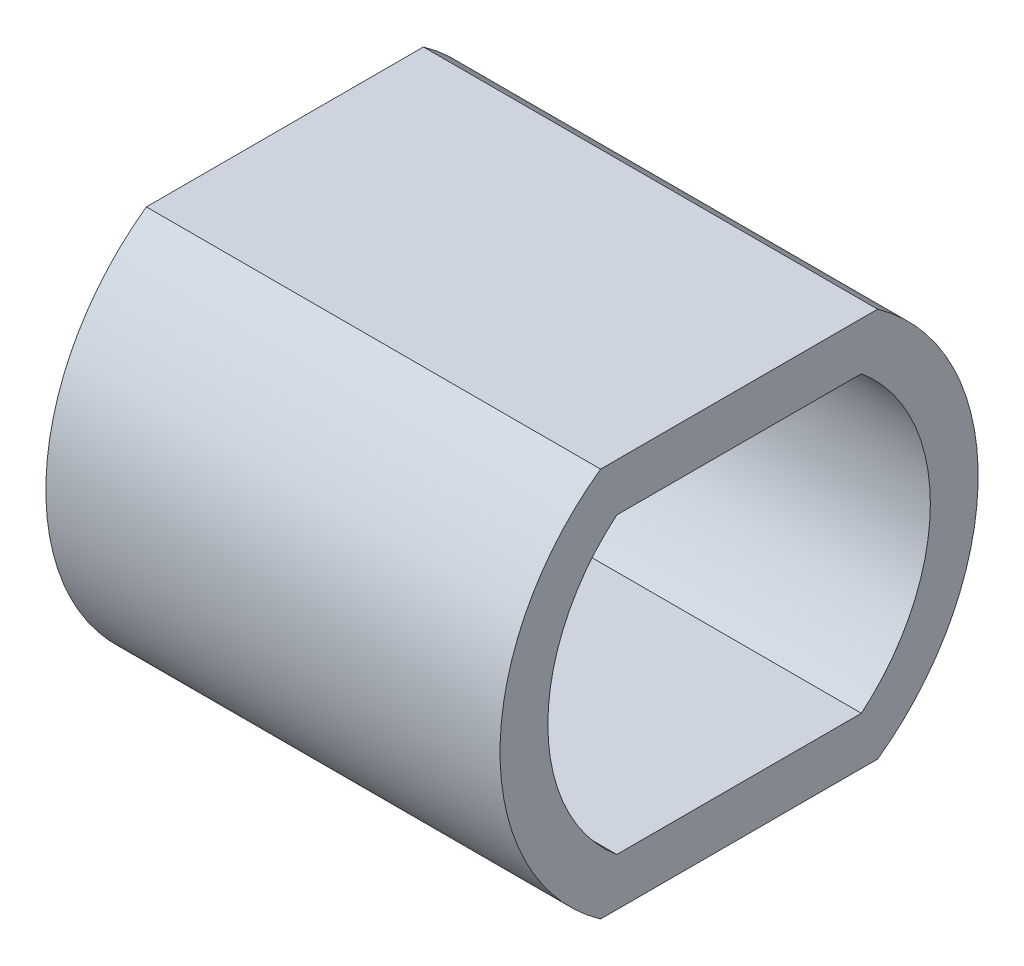
ISO-10303-21;
HEADER;
FILE_DESCRIPTION(('STEP AP214'),'2;1');
FILE_NAME('part.step','',(''),(''),'','','');
FILE_SCHEMA(('AUTOMOTIVE_DESIGN { 1 0 10303 214 1 1 1 1 }'));
ENDSEC;
DATA;
#1=APPLICATION_CONTEXT('core data for automotive mechanical design processes');
#2=APPLICATION_PROTOCOL_DEFINITION('international standard','automotive_design',2000,#1);
#3=PRODUCT_CONTEXT('',#1,'mechanical');
#4=PRODUCT('Part','Part','',(#3));
#5=PRODUCT_RELATED_PRODUCT_CATEGORY('part','',(#4));
#6=PRODUCT_DEFINITION_FORMATION('','',#4);
#7=PRODUCT_DEFINITION_CONTEXT('part definition',#1,'design');
#8=PRODUCT_DEFINITION('design','',#6,#7);
#9=PRODUCT_DEFINITION_SHAPE('','',#8);
#10=(LENGTH_UNIT() NAMED_UNIT(*) SI_UNIT(.MILLI.,.METRE.));
#11=(NAMED_UNIT(*) PLANE_ANGLE_UNIT() SI_UNIT($,.RADIAN.));
#12=(NAMED_UNIT(*) SI_UNIT($,.STERADIAN.) SOLID_ANGLE_UNIT());
#13=UNCERTAINTY_MEASURE_WITH_UNIT(LENGTH_MEASURE(1.E-05),#10,'distance_accuracy_value','');
#14=(GEOMETRIC_REPRESENTATION_CONTEXT(3) GLOBAL_UNCERTAINTY_ASSIGNED_CONTEXT((#13)) GLOBAL_UNIT_ASSIGNED_CONTEXT((#10,
#11,#12)) REPRESENTATION_CONTEXT('',''));
#15=CARTESIAN_POINT('',(0.,0.,0.));
#16=DIRECTION('',(0.,0.,1.));
#17=DIRECTION('',(1.,0.,0.));
#18=AXIS2_PLACEMENT_3D('',#15,#16,#17);
#19=CARTESIAN_POINT('',(-2.,-1.3,0.));
#20=DIRECTION('',(0.,1.,0.));
#21=DIRECTION('',(0.,0.,1.));
#22=AXIS2_PLACEMENT_3D('',#19,#20,#21);
#23=PLANE('',#22);
#24=DIRECTION('',(0.,0.,1.));
#25=VECTOR('',#24,1.);
#26=CARTESIAN_POINT('',(0.,-1.3,0.));
#27=LINE('',#26,#25);
#28=CARTESIAN_POINT('',(0.,-1.3,5.7));
#29=VERTEX_POINT('',#28);
#30=CARTESIAN_POINT('',(0.,-1.3,6.5));
#31=VERTEX_POINT('',#30);
#32=EDGE_CURVE('E280',#29,#31,#27,.T.);
#33=ORIENTED_EDGE('',*,*,#32,.F.);
#34=DIRECTION('',(1.,0.,0.));
#35=VECTOR('',#34,1.);
#36=CARTESIAN_POINT('',(-2.,-1.3,5.7));
#37=LINE('',#36,#35);
#38=CARTESIAN_POINT('',(-2.,-1.3,5.7));
#39=VERTEX_POINT('',#38);
#40=EDGE_CURVE('E12',#39,#29,#37,.T.);
#41=ORIENTED_EDGE('',*,*,#40,.F.);
#42=DIRECTION('',(0.,0.,1.));
#43=VECTOR('',#42,1.);
#44=CARTESIAN_POINT('',(-2.,-1.3,0.));
#45=LINE('',#44,#43);
#46=CARTESIAN_POINT('',(-2.,-1.3,6.5));
#47=VERTEX_POINT('',#46);
#48=EDGE_CURVE('E255',#39,#47,#45,.T.);
#49=ORIENTED_EDGE('',*,*,#48,.T.);
#50=DIRECTION('',(1.,0.,0.));
#51=VECTOR('',#50,1.);
#52=CARTESIAN_POINT('',(-2.,-1.3,6.5));
#53=LINE('',#52,#51);
#54=EDGE_CURVE('E304',#47,#31,#53,.T.);
#55=ORIENTED_EDGE('',*,*,#54,.T.);
#56=EDGE_LOOP('',(#33,#41,#49,#55));
#57=FACE_BOUND('',#56,.T.);
#58=ADVANCED_FACE('F85',(#57),#23,.T.);
#59=CARTESIAN_POINT('',(-2.,0.,5.7));
#60=DIRECTION('',(0.,0.,-1.));
#61=DIRECTION('',(-1.,0.,0.));
#62=AXIS2_PLACEMENT_3D('',#59,#60,#61);
#63=PLANE('',#62);
#64=DIRECTION('',(0.,1.,0.));
#65=VECTOR('',#64,1.);
#66=CARTESIAN_POINT('',(0.,0.,5.7));
#67=LINE('',#66,#65);
#68=CARTESIAN_POINT('',(0.,1.3,5.7));
#69=VERTEX_POINT('',#68);
#70=EDGE_CURVE('E289',#29,#69,#67,.T.);
#71=ORIENTED_EDGE('',*,*,#70,.T.);
#72=DIRECTION('',(1.,0.,0.));
#73=VECTOR('',#72,1.);
#74=CARTESIAN_POINT('',(-2.,1.3,5.7));
#75=LINE('',#74,#73);
#76=CARTESIAN_POINT('',(-2.,1.3,5.7));
#77=VERTEX_POINT('',#76);
#78=EDGE_CURVE('E95',#77,#69,#75,.T.);
#79=ORIENTED_EDGE('',*,*,#78,.F.);
#80=DIRECTION('',(0.,1.,0.));
#81=VECTOR('',#80,1.);
#82=CARTESIAN_POINT('',(-2.,0.,5.7));
#83=LINE('',#82,#81);
#84=EDGE_CURVE('E196',#39,#77,#83,.T.);
#85=ORIENTED_EDGE('',*,*,#84,.F.);
#86=ORIENTED_EDGE('',*,*,#40,.T.);
#87=EDGE_LOOP('',(#71,#79,#85,#86));
#88=FACE_BOUND('',#87,.T.);
#89=ADVANCED_FACE('F425',(#88),#63,.F.);
#90=CARTESIAN_POINT('',(-2.,1.3,0.));
#91=DIRECTION('',(0.,1.,0.));
#92=DIRECTION('',(0.,0.,1.));
#93=AXIS2_PLACEMENT_3D('',#90,#91,#92);
#94=PLANE('',#93);
#95=DIRECTION('',(0.,0.,1.));
#96=VECTOR('',#95,1.);
#97=CARTESIAN_POINT('',(0.,1.3,0.));
#98=LINE('',#97,#96);
#99=CARTESIAN_POINT('',(0.,1.3,6.5));
#100=VERTEX_POINT('',#99);
#101=EDGE_CURVE('E286',#69,#100,#98,.T.);
#102=ORIENTED_EDGE('',*,*,#101,.T.);
#103=DIRECTION('',(1.,0.,0.));
#104=VECTOR('',#103,1.);
#105=CARTESIAN_POINT('',(-2.,1.3,6.5));
#106=LINE('',#105,#104);
#107=CARTESIAN_POINT('',(-2.,1.3,6.5));
#108=VERTEX_POINT('',#107);
#109=EDGE_CURVE('E302',#108,#100,#106,.T.);
#110=ORIENTED_EDGE('',*,*,#109,.F.);
#111=DIRECTION('',(0.,0.,1.));
#112=VECTOR('',#111,1.);
#113=CARTESIAN_POINT('',(-2.,1.3,0.));
#114=LINE('',#113,#112);
#115=EDGE_CURVE('E261',#77,#108,#114,.T.);
#116=ORIENTED_EDGE('',*,*,#115,.F.);
#117=ORIENTED_EDGE('',*,*,#78,.T.);
#118=EDGE_LOOP('',(#102,#110,#116,#117));
#119=FACE_BOUND('',#118,.T.);
#120=ADVANCED_FACE('F431',(#119),#94,.F.);
#121=CARTESIAN_POINT('',(-2.,-1.3,0.));
#122=DIRECTION('',(0.,1.,0.));
#123=DIRECTION('',(0.,0.,1.));
#124=AXIS2_PLACEMENT_3D('',#121,#122,#123);
#125=PLANE('',#124);
#126=DIRECTION('',(0.,0.,1.));
#127=VECTOR('',#126,1.);
#128=CARTESIAN_POINT('',(0.,-1.3,0.));
#129=LINE('',#128,#127);
#130=CARTESIAN_POINT('',(0.,-1.3,-6.5));
#131=VERTEX_POINT('',#130);
#132=CARTESIAN_POINT('',(0.,-1.3,-5.7));
#133=VERTEX_POINT('',#132);
#134=EDGE_CURVE('E268',#131,#133,#129,.T.);
#135=ORIENTED_EDGE('',*,*,#134,.F.);
#136=DIRECTION('',(1.,0.,0.));
#137=VECTOR('',#136,1.);
#138=CARTESIAN_POINT('',(-2.,-1.3,-6.5));
#139=LINE('',#138,#137);
#140=CARTESIAN_POINT('',(-2.,-1.3,-6.5));
#141=VERTEX_POINT('',#140);
#142=EDGE_CURVE('E306',#141,#131,#139,.T.);
#143=ORIENTED_EDGE('',*,*,#142,.F.);
#144=DIRECTION('',(0.,0.,1.));
#145=VECTOR('',#144,1.);
#146=CARTESIAN_POINT('',(-2.,-1.3,0.));
#147=LINE('',#146,#145);
#148=CARTESIAN_POINT('',(-2.,-1.3,-5.7));
#149=VERTEX_POINT('',#148);
#150=EDGE_CURVE('E244',#141,#149,#147,.T.);
#151=ORIENTED_EDGE('',*,*,#150,.T.);
#152=DIRECTION('',(1.,0.,0.));
#153=VECTOR('',#152,1.);
#154=CARTESIAN_POINT('',(-2.,-1.3,-5.7));
#155=LINE('',#154,#153);
#156=EDGE_CURVE('E89',#149,#133,#155,.T.);
#157=ORIENTED_EDGE('',*,*,#156,.T.);
#158=EDGE_LOOP('',(#135,#143,#151,#157));
#159=FACE_BOUND('',#158,.T.);
#160=ADVANCED_FACE('F442',(#159),#125,.T.);
#161=CARTESIAN_POINT('',(-2.,0.,-6.5));
#162=DIRECTION('',(0.,0.,-1.));
#163=DIRECTION('',(-1.,0.,0.));
#164=AXIS2_PLACEMENT_3D('',#161,#162,#163);
#165=PLANE('',#164);
#166=DIRECTION('',(0.,1.,0.));
#167=VECTOR('',#166,1.);
#168=CARTESIAN_POINT('',(0.,0.,-6.5));
#169=LINE('',#168,#167);
#170=CARTESIAN_POINT('',(0.,1.3,-6.5));
#171=VERTEX_POINT('',#170);
#172=EDGE_CURVE('E277',#131,#171,#169,.T.);
#173=ORIENTED_EDGE('',*,*,#172,.T.);
#174=DIRECTION('',(1.,0.,0.));
#175=VECTOR('',#174,1.);
#176=CARTESIAN_POINT('',(-2.,1.3,-6.5));
#177=LINE('',#176,#175);
#178=CARTESIAN_POINT('',(-2.,1.3,-6.5));
#179=VERTEX_POINT('',#178);
#180=EDGE_CURVE('E308',#179,#171,#177,.T.);
#181=ORIENTED_EDGE('',*,*,#180,.F.);
#182=DIRECTION('',(0.,1.,0.));
#183=VECTOR('',#182,1.);
#184=CARTESIAN_POINT('',(-2.,0.,-6.5));
#185=LINE('',#184,#183);
#186=EDGE_CURVE('E252',#141,#179,#185,.T.);
#187=ORIENTED_EDGE('',*,*,#186,.F.);
#188=ORIENTED_EDGE('',*,*,#142,.T.);
#189=EDGE_LOOP('',(#173,#181,#187,#188));
#190=FACE_BOUND('',#189,.T.);
#191=ADVANCED_FACE('F438',(#190),#165,.F.);
#192=CARTESIAN_POINT('',(-2.,1.3,0.));
#193=DIRECTION('',(0.,1.,0.));
#194=DIRECTION('',(0.,0.,1.));
#195=AXIS2_PLACEMENT_3D('',#192,#193,#194);
#196=PLANE('',#195);
#197=DIRECTION('',(0.,0.,1.));
#198=VECTOR('',#197,1.);
#199=CARTESIAN_POINT('',(0.,1.3,0.));
#200=LINE('',#199,#198);
#201=CARTESIAN_POINT('',(0.,1.3,-5.7));
#202=VERTEX_POINT('',#201);
#203=EDGE_CURVE('E274',#171,#202,#200,.T.);
#204=ORIENTED_EDGE('',*,*,#203,.T.);
#205=DIRECTION('',(1.,0.,0.));
#206=VECTOR('',#205,1.);
#207=CARTESIAN_POINT('',(-2.,1.3,-5.7));
#208=LINE('',#207,#206);
#209=CARTESIAN_POINT('',(-2.,1.3,-5.7));
#210=VERTEX_POINT('',#209);
#211=EDGE_CURVE('E310',#210,#202,#208,.T.);
#212=ORIENTED_EDGE('',*,*,#211,.F.);
#213=DIRECTION('',(0.,0.,1.));
#214=VECTOR('',#213,1.);
#215=CARTESIAN_POINT('',(-2.,1.3,0.));
#216=LINE('',#215,#214);
#217=EDGE_CURVE('E250',#179,#210,#216,.T.);
#218=ORIENTED_EDGE('',*,*,#217,.F.);
#219=ORIENTED_EDGE('',*,*,#180,.T.);
#220=EDGE_LOOP('',(#204,#212,#218,#219));
#221=FACE_BOUND('',#220,.T.);
#222=ADVANCED_FACE('F441',(#221),#196,.F.);
#223=CARTESIAN_POINT('',(-2.,0.,6.5));
#224=DIRECTION('',(0.,0.,-1.));
#225=DIRECTION('',(-1.,0.,0.));
#226=AXIS2_PLACEMENT_3D('',#223,#224,#225);
#227=PLANE('',#226);
#228=DIRECTION('',(0.,1.,0.));
#229=VECTOR('',#228,1.);
#230=CARTESIAN_POINT('',(0.,0.,6.5));
#231=LINE('',#230,#229);
#232=EDGE_CURVE('E283',#31,#100,#231,.T.);
#233=ORIENTED_EDGE('',*,*,#232,.F.);
#234=ORIENTED_EDGE('',*,*,#54,.F.);
#235=DIRECTION('',(0.,1.,0.));
#236=VECTOR('',#235,1.);
#237=CARTESIAN_POINT('',(-2.,0.,6.5));
#238=LINE('',#237,#236);
#239=EDGE_CURVE('E258',#47,#108,#238,.T.);
#240=ORIENTED_EDGE('',*,*,#239,.T.);
#241=ORIENTED_EDGE('',*,*,#109,.T.);
#242=EDGE_LOOP('',(#233,#234,#240,#241));
#243=FACE_BOUND('',#242,.T.);
#244=ADVANCED_FACE('F436',(#243),#227,.T.);
#245=CARTESIAN_POINT('',(-2.,0.,-5.7));
#246=DIRECTION('',(0.,0.,-1.));
#247=DIRECTION('',(-1.,0.,0.));
#248=AXIS2_PLACEMENT_3D('',#245,#246,#247);
#249=PLANE('',#248);
#250=DIRECTION('',(0.,1.,0.));
#251=VECTOR('',#250,1.);
#252=CARTESIAN_POINT('',(0.,0.,-5.7));
#253=LINE('',#252,#251);
#254=EDGE_CURVE('E271',#133,#202,#253,.T.);
#255=ORIENTED_EDGE('',*,*,#254,.F.);
#256=ORIENTED_EDGE('',*,*,#156,.F.);
#257=DIRECTION('',(0.,1.,0.));
#258=VECTOR('',#257,1.);
#259=CARTESIAN_POINT('',(-2.,0.,-5.7));
#260=LINE('',#259,#258);
#261=EDGE_CURVE('E248',#149,#210,#260,.T.);
#262=ORIENTED_EDGE('',*,*,#261,.T.);
#263=ORIENTED_EDGE('',*,*,#211,.T.);
#264=EDGE_LOOP('',(#255,#256,#262,#263));
#265=FACE_BOUND('',#264,.T.);
#266=ADVANCED_FACE('F447',(#265),#249,.T.);
#267=CARTESIAN_POINT('',(-2.,0.,0.));
#268=DIRECTION('',(1.,0.,0.));
#269=DIRECTION('',(0.,0.,-1.));
#270=AXIS2_PLACEMENT_3D('',#267,#268,#269);
#271=CYLINDRICAL_SURFACE('',#270,4.5);
#272=CARTESIAN_POINT('',(-2.,0.,0.));
#273=DIRECTION('',(1.,0.,0.));
#274=DIRECTION('',(0.,0.,-1.));
#275=AXIS2_PLACEMENT_3D('',#272,#273,#274);
#276=CIRCLE('',#275,4.5);
#277=CARTESIAN_POINT('',(-2.,0.,-4.5));
#278=VERTEX_POINT('',#277);
#279=EDGE_CURVE('E241',#278,#278,#276,.T.);
#280=ORIENTED_EDGE('',*,*,#279,.F.);
#281=EDGE_LOOP('',(#280));
#282=FACE_BOUND('',#281,.T.);
#283=CARTESIAN_POINT('',(0.,0.,0.));
#284=DIRECTION('',(1.,0.,0.));
#285=DIRECTION('',(0.,0.,-1.));
#286=AXIS2_PLACEMENT_3D('',#283,#284,#285);
#287=CIRCLE('',#286,4.5);
#288=CARTESIAN_POINT('',(0.,0.,-4.5));
#289=VERTEX_POINT('',#288);
#290=EDGE_CURVE('E240',#289,#289,#287,.T.);
#291=ORIENTED_EDGE('',*,*,#290,.T.);
#292=EDGE_LOOP('',(#291));
#293=FACE_BOUND('',#292,.T.);
#294=ADVANCED_FACE('F87',(#282,#293),#271,.F.);
#295=CARTESIAN_POINT('',(-2.,0.,0.));
#296=DIRECTION('',(1.,0.,0.));
#297=DIRECTION('',(0.,0.,-1.));
#298=AXIS2_PLACEMENT_3D('',#295,#296,#297);
#299=PLANE('',#298);
#300=ORIENTED_EDGE('',*,*,#279,.T.);
#301=EDGE_LOOP('',(#300));
#302=FACE_BOUND('',#301,.T.);
#303=ORIENTED_EDGE('',*,*,#150,.F.);
#304=ORIENTED_EDGE('',*,*,#186,.T.);
#305=ORIENTED_EDGE('',*,*,#217,.T.);
#306=ORIENTED_EDGE('',*,*,#261,.F.);
#307=EDGE_LOOP('',(#303,#304,#305,#306));
#308=FACE_BOUND('',#307,.T.);
#309=ORIENTED_EDGE('',*,*,#48,.F.);
#310=ORIENTED_EDGE('',*,*,#84,.T.);
#311=ORIENTED_EDGE('',*,*,#115,.T.);
#312=ORIENTED_EDGE('',*,*,#239,.F.);
#313=EDGE_LOOP('',(#309,#310,#311,#312));
#314=FACE_BOUND('',#313,.T.);
#315=DIRECTION('',(0.,0.,-1.));
#316=VECTOR('',#315,1.);
#317=CARTESIAN_POINT('',(-2.,6.15,0.));
#318=LINE('',#317,#316);
#319=CARTESIAN_POINT('',(-2.,6.15,5.11639521538358));
#320=VERTEX_POINT('',#319);
#321=CARTESIAN_POINT('',(-2.,6.15,-5.11639521538358));
#322=VERTEX_POINT('',#321);
#323=EDGE_CURVE('E104',#320,#322,#318,.T.);
#324=ORIENTED_EDGE('',*,*,#323,.T.);
#325=CARTESIAN_POINT('',(-2.,0.,0.));
#326=DIRECTION('',(1.,0.,0.));
#327=DIRECTION('',(0.,0.,-1.));
#328=AXIS2_PLACEMENT_3D('',#325,#326,#327);
#329=CIRCLE('',#328,8.);
#330=CARTESIAN_POINT('',(-2.,-6.15,-5.11639521538358));
#331=VERTEX_POINT('',#330);
#332=EDGE_CURVE('E185',#331,#322,#329,.T.);
#333=ORIENTED_EDGE('',*,*,#332,.F.);
#334=DIRECTION('',(0.,0.,-1.));
#335=VECTOR('',#334,1.);
#336=CARTESIAN_POINT('',(-2.,-6.15,0.));
#337=LINE('',#336,#335);
#338=CARTESIAN_POINT('',(-2.,-6.15,5.11639521538358));
#339=VERTEX_POINT('',#338);
#340=EDGE_CURVE('E179',#339,#331,#337,.T.);
#341=ORIENTED_EDGE('',*,*,#340,.F.);
#342=EDGE_CURVE('E175',#320,#339,#329,.T.);
#343=ORIENTED_EDGE('',*,*,#342,.F.);
#344=EDGE_LOOP('',(#324,#333,#341,#343));
#345=FACE_BOUND('',#344,.T.);
#346=ADVANCED_FACE('F176',(#302,#308,#314,#345),#299,.F.);
#347=CARTESIAN_POINT('',(0.,0.,0.));
#348=DIRECTION('',(1.,0.,0.));
#349=DIRECTION('',(0.,0.,-1.));
#350=AXIS2_PLACEMENT_3D('',#347,#348,#349);
#351=PLANE('',#350);
#352=ORIENTED_EDGE('',*,*,#290,.F.);
#353=EDGE_LOOP('',(#352));
#354=FACE_BOUND('',#353,.T.);
#355=ORIENTED_EDGE('',*,*,#134,.T.);
#356=ORIENTED_EDGE('',*,*,#254,.T.);
#357=ORIENTED_EDGE('',*,*,#203,.F.);
#358=ORIENTED_EDGE('',*,*,#172,.F.);
#359=EDGE_LOOP('',(#355,#356,#357,#358));
#360=FACE_BOUND('',#359,.T.);
#361=ORIENTED_EDGE('',*,*,#32,.T.);
#362=ORIENTED_EDGE('',*,*,#232,.T.);
#363=ORIENTED_EDGE('',*,*,#101,.F.);
#364=ORIENTED_EDGE('',*,*,#70,.F.);
#365=EDGE_LOOP('',(#361,#362,#363,#364));
#366=FACE_BOUND('',#365,.T.);
#367=DIRECTION('',(0.,0.,-1.));
#368=VECTOR('',#367,1.);
#369=CARTESIAN_POINT('',(0.,6.15,0.));
#370=LINE('',#369,#368);
#371=CARTESIAN_POINT('',(0.,6.15,5.11639521538358));
#372=VERTEX_POINT('',#371);
#373=CARTESIAN_POINT('',(0.,6.15,-5.11639521538358));
#374=VERTEX_POINT('',#373);
#375=EDGE_CURVE('E291',#372,#374,#370,.T.);
#376=ORIENTED_EDGE('',*,*,#375,.F.);
#377=CARTESIAN_POINT('',(0.,0.,0.));
#378=DIRECTION('',(1.,0.,0.));
#379=DIRECTION('',(0.,0.,-1.));
#380=AXIS2_PLACEMENT_3D('',#377,#378,#379);
#381=CIRCLE('',#380,8.);
#382=CARTESIAN_POINT('',(0.,-6.15,5.11639521538358));
#383=VERTEX_POINT('',#382);
#384=EDGE_CURVE('E294',#372,#383,#381,.T.);
#385=ORIENTED_EDGE('',*,*,#384,.T.);
#386=DIRECTION('',(0.,0.,-1.));
#387=VECTOR('',#386,1.);
#388=CARTESIAN_POINT('',(0.,-6.15,0.));
#389=LINE('',#388,#387);
#390=CARTESIAN_POINT('',(0.,-6.15,-5.11639521538358));
#391=VERTEX_POINT('',#390);
#392=EDGE_CURVE('E297',#383,#391,#389,.T.);
#393=ORIENTED_EDGE('',*,*,#392,.T.);
#394=EDGE_CURVE('E245',#391,#374,#381,.T.);
#395=ORIENTED_EDGE('',*,*,#394,.T.);
#396=EDGE_LOOP('',(#376,#385,#393,#395));
#397=FACE_BOUND('',#396,.T.);
#398=ADVANCED_FACE('F411',(#354,#360,#366,#397),#351,.T.);
#399=CARTESIAN_POINT('',(-4.,6.15,0.));
#400=DIRECTION('',(0.,-1.,0.));
#401=DIRECTION('',(0.,0.,-1.));
#402=AXIS2_PLACEMENT_3D('',#399,#400,#401);
#403=PLANE('',#402);
#404=ORIENTED_EDGE('',*,*,#323,.F.);
#405=DIRECTION('',(1.,0.,0.));
#406=VECTOR('',#405,1.);
#407=CARTESIAN_POINT('',(-4.,6.15,5.11639521538358));
#408=LINE('',#407,#406);
#409=CARTESIAN_POINT('',(-4.,6.15,5.11639521538358));
#410=VERTEX_POINT('',#409);
#411=EDGE_CURVE('E192',#410,#320,#408,.T.);
#412=ORIENTED_EDGE('',*,*,#411,.F.);
#413=DIRECTION('',(0.,0.,-1.));
#414=VECTOR('',#413,1.);
#415=CARTESIAN_POINT('',(-4.,6.15,0.));
#416=LINE('',#415,#414);
#417=CARTESIAN_POINT('',(-4.,6.15,-5.11639521538358));
#418=VERTEX_POINT('',#417);
#419=EDGE_CURVE('E334',#410,#418,#416,.T.);
#420=ORIENTED_EDGE('',*,*,#419,.T.);
#421=DIRECTION('',(1.,0.,0.));
#422=VECTOR('',#421,1.);
#423=CARTESIAN_POINT('',(-4.,6.15,-5.11639521538358));
#424=LINE('',#423,#422);
#425=EDGE_CURVE('E195',#418,#322,#424,.T.);
#426=ORIENTED_EDGE('',*,*,#425,.T.);
#427=EDGE_LOOP('',(#404,#412,#420,#426));
#428=FACE_BOUND('',#427,.T.);
#429=ADVANCED_FACE('F189',(#428),#403,.T.);
#430=CARTESIAN_POINT('',(-4.,0.,0.));
#431=DIRECTION('',(1.,0.,0.));
#432=DIRECTION('',(0.,0.,-1.));
#433=AXIS2_PLACEMENT_3D('',#430,#431,#432);
#434=CYLINDRICAL_SURFACE('',#433,8.);
#435=DIRECTION('',(1.,0.,0.));
#436=VECTOR('',#435,1.);
#437=CARTESIAN_POINT('',(-4.,-6.15,-5.11639521538358));
#438=LINE('',#437,#436);
#439=CARTESIAN_POINT('',(-4.,-6.15,-5.11639521538358));
#440=VERTEX_POINT('',#439);
#441=EDGE_CURVE('E211',#440,#331,#438,.T.);
#442=ORIENTED_EDGE('',*,*,#441,.T.);
#443=ORIENTED_EDGE('',*,*,#332,.T.);
#444=ORIENTED_EDGE('',*,*,#425,.F.);
#445=CARTESIAN_POINT('',(-4.,0.,0.));
#446=DIRECTION('',(1.,0.,0.));
#447=DIRECTION('',(0.,0.,-1.));
#448=AXIS2_PLACEMENT_3D('',#445,#446,#447);
#449=CIRCLE('',#448,8.);
#450=EDGE_CURVE('E335',#440,#418,#449,.T.);
#451=ORIENTED_EDGE('',*,*,#450,.F.);
#452=EDGE_LOOP('',(#442,#443,#444,#451));
#453=FACE_BOUND('',#452,.T.);
#454=ADVANCED_FACE('F315',(#453),#434,.F.);
#455=CARTESIAN_POINT('',(-4.,-6.15,0.));
#456=DIRECTION('',(0.,-1.,0.));
#457=DIRECTION('',(0.,0.,-1.));
#458=AXIS2_PLACEMENT_3D('',#455,#456,#457);
#459=PLANE('',#458);
#460=DIRECTION('',(1.,0.,0.));
#461=VECTOR('',#460,1.);
#462=CARTESIAN_POINT('',(-4.,-6.15,5.11639521538358));
#463=LINE('',#462,#461);
#464=CARTESIAN_POINT('',(-4.,-6.15,5.11639521538358));
#465=VERTEX_POINT('',#464);
#466=EDGE_CURVE('E204',#465,#339,#463,.T.);
#467=ORIENTED_EDGE('',*,*,#466,.T.);
#468=ORIENTED_EDGE('',*,*,#340,.T.);
#469=ORIENTED_EDGE('',*,*,#441,.F.);
#470=DIRECTION('',(0.,0.,-1.));
#471=VECTOR('',#470,1.);
#472=CARTESIAN_POINT('',(-4.,-6.15,0.));
#473=LINE('',#472,#471);
#474=EDGE_CURVE('E326',#465,#440,#473,.T.);
#475=ORIENTED_EDGE('',*,*,#474,.F.);
#476=EDGE_LOOP('',(#467,#468,#469,#475));
#477=FACE_BOUND('',#476,.T.);
#478=ADVANCED_FACE('F321',(#477),#459,.F.);
#479=CARTESIAN_POINT('',(-4.,0.,0.));
#480=DIRECTION('',(1.,0.,0.));
#481=DIRECTION('',(0.,0.,-1.));
#482=AXIS2_PLACEMENT_3D('',#479,#480,#481);
#483=CYLINDRICAL_SURFACE('',#482,8.);
#484=ORIENTED_EDGE('',*,*,#411,.T.);
#485=ORIENTED_EDGE('',*,*,#342,.T.);
#486=ORIENTED_EDGE('',*,*,#466,.F.);
#487=CARTESIAN_POINT('',(-4.,0.,0.));
#488=DIRECTION('',(1.,0.,0.));
#489=DIRECTION('',(0.,0.,-1.));
#490=AXIS2_PLACEMENT_3D('',#487,#488,#489);
#491=CIRCLE('',#490,8.);
#492=EDGE_CURVE('E200',#410,#465,#491,.T.);
#493=ORIENTED_EDGE('',*,*,#492,.F.);
#494=EDGE_LOOP('',(#484,#485,#486,#493));
#495=FACE_BOUND('',#494,.T.);
#496=ADVANCED_FACE('F198',(#495),#483,.F.);
#497=CARTESIAN_POINT('',(-4.,0.,0.));
#498=DIRECTION('',(1.,0.,0.));
#499=DIRECTION('',(0.,0.,-1.));
#500=AXIS2_PLACEMENT_3D('',#497,#498,#499);
#501=PLANE('',#500);
#502=DIRECTION('',(0.,0.,-1.));
#503=VECTOR('',#502,1.);
#504=CARTESIAN_POINT('',(-4.,8.15,0.));
#505=LINE('',#504,#503);
#506=CARTESIAN_POINT('',(-4.,8.15,5.79460956406901));
#507=VERTEX_POINT('',#506);
#508=CARTESIAN_POINT('',(-4.,8.15,-5.79460956406901));
#509=VERTEX_POINT('',#508);
#510=EDGE_CURVE('E216',#507,#509,#505,.T.);
#511=ORIENTED_EDGE('',*,*,#510,.T.);
#512=CARTESIAN_POINT('',(-4.,0.,0.));
#513=DIRECTION('',(1.,0.,0.));
#514=DIRECTION('',(0.,0.,-1.));
#515=AXIS2_PLACEMENT_3D('',#512,#513,#514);
#516=CIRCLE('',#515,10.);
#517=CARTESIAN_POINT('',(-4.,-8.15,-5.79460956406901));
#518=VERTEX_POINT('',#517);
#519=EDGE_CURVE('E219',#518,#509,#516,.T.);
#520=ORIENTED_EDGE('',*,*,#519,.F.);
#521=DIRECTION('',(0.,0.,-1.));
#522=VECTOR('',#521,1.);
#523=CARTESIAN_POINT('',(-4.,-8.15,0.));
#524=LINE('',#523,#522);
#525=CARTESIAN_POINT('',(-4.,-8.15,5.79460956406901));
#526=VERTEX_POINT('',#525);
#527=EDGE_CURVE('E222',#526,#518,#524,.T.);
#528=ORIENTED_EDGE('',*,*,#527,.F.);
#529=CARTESIAN_POINT('',(-4.,0.,0.));
#530=DIRECTION('',(1.,0.,0.));
#531=DIRECTION('',(0.,0.,-1.));
#532=AXIS2_PLACEMENT_3D('',#529,#530,#531);
#533=CIRCLE('',#532,10.);
#534=EDGE_CURVE('E225',#507,#526,#533,.T.);
#535=ORIENTED_EDGE('',*,*,#534,.F.);
#536=EDGE_LOOP('',(#511,#520,#528,#535));
#537=FACE_BOUND('',#536,.T.);
#538=ORIENTED_EDGE('',*,*,#419,.F.);
#539=ORIENTED_EDGE('',*,*,#492,.T.);
#540=ORIENTED_EDGE('',*,*,#474,.T.);
#541=ORIENTED_EDGE('',*,*,#450,.T.);
#542=EDGE_LOOP('',(#538,#539,#540,#541));
#543=FACE_BOUND('',#542,.T.);
#544=ADVANCED_FACE('F333',(#537,#543),#501,.F.);
#545=CARTESIAN_POINT('',(-4.,8.15,0.));
#546=DIRECTION('',(0.,-1.,0.));
#547=DIRECTION('',(0.,0.,-1.));
#548=AXIS2_PLACEMENT_3D('',#545,#546,#547);
#549=PLANE('',#548);
#550=DIRECTION('',(1.,0.,0.));
#551=VECTOR('',#550,1.);
#552=CARTESIAN_POINT('',(-4.,8.15,5.79460956406901));
#553=LINE('',#552,#551);
#554=CARTESIAN_POINT('',(15.,8.15,5.79460956406901));
#555=VERTEX_POINT('',#554);
#556=EDGE_CURVE('E228',#507,#555,#553,.T.);
#557=ORIENTED_EDGE('',*,*,#556,.T.);
#558=DIRECTION('',(0.,0.,-1.));
#559=VECTOR('',#558,1.);
#560=CARTESIAN_POINT('',(15.,8.15,0.));
#561=LINE('',#560,#559);
#562=CARTESIAN_POINT('',(15.,8.15,-5.79460956406901));
#563=VERTEX_POINT('',#562);
#564=EDGE_CURVE('E348',#555,#563,#561,.T.);
#565=ORIENTED_EDGE('',*,*,#564,.T.);
#566=DIRECTION('',(1.,0.,0.));
#567=VECTOR('',#566,1.);
#568=CARTESIAN_POINT('',(-4.,8.15,-5.79460956406901));
#569=LINE('',#568,#567);
#570=EDGE_CURVE('E237',#509,#563,#569,.T.);
#571=ORIENTED_EDGE('',*,*,#570,.F.);
#572=ORIENTED_EDGE('',*,*,#510,.F.);
#573=EDGE_LOOP('',(#557,#565,#571,#572));
#574=FACE_BOUND('',#573,.T.);
#575=ADVANCED_FACE('F480',(#574),#549,.F.);
#576=CARTESIAN_POINT('',(-4.,0.,0.));
#577=DIRECTION('',(1.,0.,0.));
#578=DIRECTION('',(0.,0.,-1.));
#579=AXIS2_PLACEMENT_3D('',#576,#577,#578);
#580=CYLINDRICAL_SURFACE('',#579,10.);
#581=ORIENTED_EDGE('',*,*,#570,.T.);
#582=CARTESIAN_POINT('',(15.,0.,0.));
#583=DIRECTION('',(1.,0.,0.));
#584=DIRECTION('',(0.,0.,-1.));
#585=AXIS2_PLACEMENT_3D('',#582,#583,#584);
#586=CIRCLE('',#585,10.);
#587=CARTESIAN_POINT('',(15.,-8.15,-5.79460956406901));
#588=VERTEX_POINT('',#587);
#589=EDGE_CURVE('E345',#588,#563,#586,.T.);
#590=ORIENTED_EDGE('',*,*,#589,.F.);
#591=DIRECTION('',(1.,0.,0.));
#592=VECTOR('',#591,1.);
#593=CARTESIAN_POINT('',(-4.,-8.15,-5.79460956406901));
#594=LINE('',#593,#592);
#595=EDGE_CURVE('E234',#518,#588,#594,.T.);
#596=ORIENTED_EDGE('',*,*,#595,.F.);
#597=ORIENTED_EDGE('',*,*,#519,.T.);
#598=EDGE_LOOP('',(#581,#590,#596,#597));
#599=FACE_BOUND('',#598,.T.);
#600=ADVANCED_FACE('F483',(#599),#580,.T.);
#601=CARTESIAN_POINT('',(-4.,-8.15,0.));
#602=DIRECTION('',(0.,-1.,0.));
#603=DIRECTION('',(0.,0.,-1.));
#604=AXIS2_PLACEMENT_3D('',#601,#602,#603);
#605=PLANE('',#604);
#606=ORIENTED_EDGE('',*,*,#595,.T.);
#607=DIRECTION('',(0.,0.,-1.));
#608=VECTOR('',#607,1.);
#609=CARTESIAN_POINT('',(15.,-8.15,0.));
#610=LINE('',#609,#608);
#611=CARTESIAN_POINT('',(15.,-8.15,5.79460956406901));
#612=VERTEX_POINT('',#611);
#613=EDGE_CURVE('E342',#612,#588,#610,.T.);
#614=ORIENTED_EDGE('',*,*,#613,.F.);
#615=DIRECTION('',(1.,0.,0.));
#616=VECTOR('',#615,1.);
#617=CARTESIAN_POINT('',(-4.,-8.15,5.79460956406901));
#618=LINE('',#617,#616);
#619=EDGE_CURVE('E231',#526,#612,#618,.T.);
#620=ORIENTED_EDGE('',*,*,#619,.F.);
#621=ORIENTED_EDGE('',*,*,#527,.T.);
#622=EDGE_LOOP('',(#606,#614,#620,#621));
#623=FACE_BOUND('',#622,.T.);
#624=ADVANCED_FACE('F487',(#623),#605,.T.);
#625=CARTESIAN_POINT('',(-4.,0.,0.));
#626=DIRECTION('',(1.,0.,0.));
#627=DIRECTION('',(0.,0.,-1.));
#628=AXIS2_PLACEMENT_3D('',#625,#626,#627);
#629=CYLINDRICAL_SURFACE('',#628,10.);
#630=ORIENTED_EDGE('',*,*,#619,.T.);
#631=CARTESIAN_POINT('',(15.,0.,0.));
#632=DIRECTION('',(1.,0.,0.));
#633=DIRECTION('',(0.,0.,-1.));
#634=AXIS2_PLACEMENT_3D('',#631,#632,#633);
#635=CIRCLE('',#634,10.);
#636=EDGE_CURVE('E339',#555,#612,#635,.T.);
#637=ORIENTED_EDGE('',*,*,#636,.F.);
#638=ORIENTED_EDGE('',*,*,#556,.F.);
#639=ORIENTED_EDGE('',*,*,#534,.T.);
#640=EDGE_LOOP('',(#630,#637,#638,#639));
#641=FACE_BOUND('',#640,.T.);
#642=ADVANCED_FACE('F491',(#641),#629,.T.);
#643=CARTESIAN_POINT('',(15.,6.15,5.11639521538358));
#644=VERTEX_POINT('',#643);
#645=EDGE_CURVE('E202',#372,#644,#408,.T.);
#646=ORIENTED_EDGE('',*,*,#645,.F.);
#647=ORIENTED_EDGE('',*,*,#375,.T.);
#648=CARTESIAN_POINT('',(15.,6.15,-5.11639521538358));
#649=VERTEX_POINT('',#648);
#650=EDGE_CURVE('E214',#374,#649,#424,.T.);
#651=ORIENTED_EDGE('',*,*,#650,.T.);
#652=DIRECTION('',(0.,0.,-1.));
#653=VECTOR('',#652,1.);
#654=CARTESIAN_POINT('',(15.,6.15,0.));
#655=LINE('',#654,#653);
#656=EDGE_CURVE('E359',#644,#649,#655,.T.);
#657=ORIENTED_EDGE('',*,*,#656,.F.);
#658=EDGE_LOOP('',(#646,#647,#651,#657));
#659=FACE_BOUND('',#658,.T.);
#660=ADVANCED_FACE('F376',(#659),#403,.T.);
#661=ORIENTED_EDGE('',*,*,#394,.F.);
#662=CARTESIAN_POINT('',(15.,-6.15,-5.11639521538358));
#663=VERTEX_POINT('',#662);
#664=EDGE_CURVE('E210',#391,#663,#438,.T.);
#665=ORIENTED_EDGE('',*,*,#664,.T.);
#666=CARTESIAN_POINT('',(15.,0.,0.));
#667=DIRECTION('',(1.,0.,0.));
#668=DIRECTION('',(0.,0.,-1.));
#669=AXIS2_PLACEMENT_3D('',#666,#667,#668);
#670=CIRCLE('',#669,8.);
#671=EDGE_CURVE('E356',#663,#649,#670,.T.);
#672=ORIENTED_EDGE('',*,*,#671,.T.);
#673=ORIENTED_EDGE('',*,*,#650,.F.);
#674=EDGE_LOOP('',(#661,#665,#672,#673));
#675=FACE_BOUND('',#674,.T.);
#676=ADVANCED_FACE('F410',(#675),#434,.F.);
#677=ORIENTED_EDGE('',*,*,#392,.F.);
#678=CARTESIAN_POINT('',(15.,-6.15,5.11639521538358));
#679=VERTEX_POINT('',#678);
#680=EDGE_CURVE('E143',#383,#679,#463,.T.);
#681=ORIENTED_EDGE('',*,*,#680,.T.);
#682=DIRECTION('',(0.,0.,-1.));
#683=VECTOR('',#682,1.);
#684=CARTESIAN_POINT('',(15.,-6.15,0.));
#685=LINE('',#684,#683);
#686=EDGE_CURVE('E353',#679,#663,#685,.T.);
#687=ORIENTED_EDGE('',*,*,#686,.T.);
#688=ORIENTED_EDGE('',*,*,#664,.F.);
#689=EDGE_LOOP('',(#677,#681,#687,#688));
#690=FACE_BOUND('',#689,.T.);
#691=ADVANCED_FACE('F413',(#690),#459,.F.);
#692=ORIENTED_EDGE('',*,*,#384,.F.);
#693=ORIENTED_EDGE('',*,*,#645,.T.);
#694=CARTESIAN_POINT('',(15.,0.,0.));
#695=DIRECTION('',(1.,0.,0.));
#696=DIRECTION('',(0.,0.,-1.));
#697=AXIS2_PLACEMENT_3D('',#694,#695,#696);
#698=CIRCLE('',#697,8.);
#699=EDGE_CURVE('E351',#644,#679,#698,.T.);
#700=ORIENTED_EDGE('',*,*,#699,.T.);
#701=ORIENTED_EDGE('',*,*,#680,.F.);
#702=EDGE_LOOP('',(#692,#693,#700,#701));
#703=FACE_BOUND('',#702,.T.);
#704=ADVANCED_FACE('F414',(#703),#483,.F.);
#705=CARTESIAN_POINT('',(15.,0.,0.));
#706=DIRECTION('',(1.,0.,0.));
#707=DIRECTION('',(0.,0.,-1.));
#708=AXIS2_PLACEMENT_3D('',#705,#706,#707);
#709=PLANE('',#708);
#710=ORIENTED_EDGE('',*,*,#656,.T.);
#711=ORIENTED_EDGE('',*,*,#671,.F.);
#712=ORIENTED_EDGE('',*,*,#686,.F.);
#713=ORIENTED_EDGE('',*,*,#699,.F.);
#714=EDGE_LOOP('',(#710,#711,#712,#713));
#715=FACE_BOUND('',#714,.T.);
#716=ORIENTED_EDGE('',*,*,#564,.F.);
#717=ORIENTED_EDGE('',*,*,#636,.T.);
#718=ORIENTED_EDGE('',*,*,#613,.T.);
#719=ORIENTED_EDGE('',*,*,#589,.T.);
#720=EDGE_LOOP('',(#716,#717,#718,#719));
#721=FACE_BOUND('',#720,.T.);
#722=ADVANCED_FACE('F366',(#715,#721),#709,.T.);
#723=CLOSED_SHELL('',(#58,#89,#120,#160,#191,#222,#244,#266,#294,#346,#398,#429,#454,#478,#496,
#544,#575,#600,#624,#642,#660,#676,#691,#704,#722));
#724=MANIFOLD_SOLID_BREP('B2',#723);
#725=ADVANCED_BREP_SHAPE_REPRESENTATION('',(#18,#724),#14);
#726=SHAPE_DEFINITION_REPRESENTATION(#9,#725);
ENDSEC;
END-ISO-10303-21;
